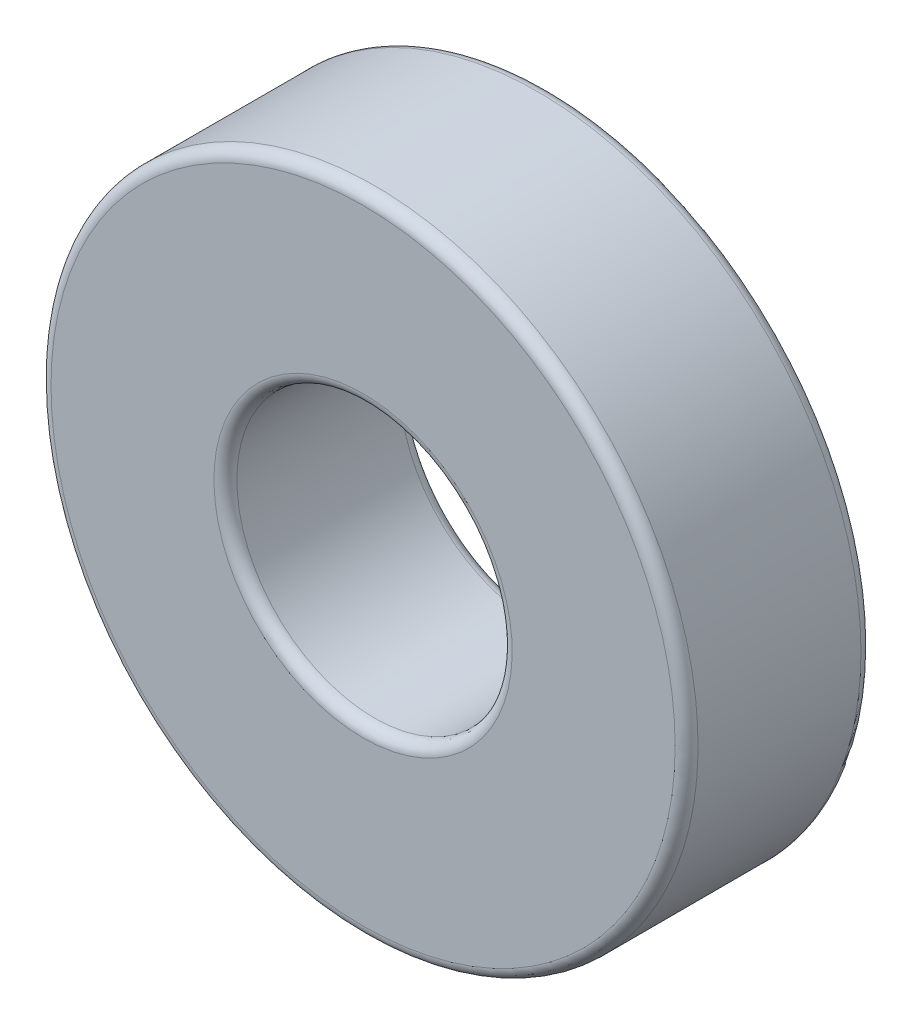
ISO-10303-21;
HEADER;
FILE_DESCRIPTION(('STEP AP214'),'2;1');
FILE_NAME('part.step','',(''),(''),'','','');
FILE_SCHEMA(('AUTOMOTIVE_DESIGN { 1 0 10303 214 1 1 1 1 }'));
ENDSEC;
DATA;
#1=APPLICATION_CONTEXT('core data for automotive mechanical design processes');
#2=APPLICATION_PROTOCOL_DEFINITION('international standard','automotive_design',2000,#1);
#3=PRODUCT_CONTEXT('',#1,'mechanical');
#4=PRODUCT('Part','Part','',(#3));
#5=PRODUCT_RELATED_PRODUCT_CATEGORY('part','',(#4));
#6=PRODUCT_DEFINITION_FORMATION('','',#4);
#7=PRODUCT_DEFINITION_CONTEXT('part definition',#1,'design');
#8=PRODUCT_DEFINITION('design','',#6,#7);
#9=PRODUCT_DEFINITION_SHAPE('','',#8);
#10=(LENGTH_UNIT() NAMED_UNIT(*) SI_UNIT(.MILLI.,.METRE.));
#11=(NAMED_UNIT(*) PLANE_ANGLE_UNIT() SI_UNIT($,.RADIAN.));
#12=(NAMED_UNIT(*) SI_UNIT($,.STERADIAN.) SOLID_ANGLE_UNIT());
#13=UNCERTAINTY_MEASURE_WITH_UNIT(LENGTH_MEASURE(1.E-05),#10,'distance_accuracy_value','');
#14=(GEOMETRIC_REPRESENTATION_CONTEXT(3) GLOBAL_UNCERTAINTY_ASSIGNED_CONTEXT((#13)) GLOBAL_UNIT_ASSIGNED_CONTEXT((#10,
#11,#12)) REPRESENTATION_CONTEXT('',''));
#15=CARTESIAN_POINT('',(0.,0.,0.));
#16=DIRECTION('',(0.,0.,1.));
#17=DIRECTION('',(1.,0.,0.));
#18=AXIS2_PLACEMENT_3D('',#15,#16,#17);
#19=CARTESIAN_POINT('',(1.95949363399733,6.33477656260915E-06,47.9808224589213));
#20=DIRECTION('',(0.,0.,-1.));
#21=DIRECTION('',(-1.,0.,0.));
#22=AXIS2_PLACEMENT_3D('',#19,#20,#21);
#23=CYLINDRICAL_SURFACE('',#22,14.1);
#24=CARTESIAN_POINT('',(1.95949363399733,6.33477656260915E-06,0.5));
#25=DIRECTION('',(0.,0.,1.));
#26=DIRECTION('',(1.,0.,0.));
#27=AXIS2_PLACEMENT_3D('',#24,#25,#26);
#28=CIRCLE('',#27,14.1);
#29=CARTESIAN_POINT('',(16.0594936339973,6.33477656260915E-06,0.5));
#30=VERTEX_POINT('',#29);
#31=EDGE_CURVE('E58',#30,#30,#28,.T.);
#32=ORIENTED_EDGE('',*,*,#31,.T.);
#33=EDGE_LOOP('',(#32));
#34=FACE_BOUND('',#33,.T.);
#35=CARTESIAN_POINT('',(1.95949363399733,6.33477656260915E-06,7.60000000000002));
#36=DIRECTION('',(0.,0.,1.));
#37=DIRECTION('',(0.,-1.,0.));
#38=AXIS2_PLACEMENT_3D('',#35,#36,#37);
#39=CIRCLE('',#38,14.1);
#40=CARTESIAN_POINT('',(1.95949363399733,-14.0999936652234,7.60000000000002));
#41=VERTEX_POINT('',#40);
#42=EDGE_CURVE('E61',#41,#41,#39,.F.);
#43=ORIENTED_EDGE('',*,*,#42,.T.);
#44=EDGE_LOOP('',(#43));
#45=FACE_BOUND('',#44,.T.);
#46=ADVANCED_FACE('F32',(#34,#45),#23,.T.);
#47=CARTESIAN_POINT('',(1.95949363399733,6.33477656260915E-06,0.));
#48=DIRECTION('',(0.,0.,1.));
#49=DIRECTION('',(1.,0.,0.));
#50=AXIS2_PLACEMENT_3D('',#47,#48,#49);
#51=PLANE('',#50);
#52=CARTESIAN_POINT('',(1.95949363399733,6.33477656260915E-06,0.));
#53=DIRECTION('',(0.,0.,1.));
#54=DIRECTION('',(1.,0.,0.));
#55=AXIS2_PLACEMENT_3D('',#52,#53,#54);
#56=CIRCLE('',#55,13.6);
#57=CARTESIAN_POINT('',(15.5594936339973,6.33477656260915E-06,0.));
#58=VERTEX_POINT('',#57);
#59=EDGE_CURVE('E52',#58,#58,#56,.F.);
#60=ORIENTED_EDGE('',*,*,#59,.T.);
#61=EDGE_LOOP('',(#60));
#62=FACE_BOUND('',#61,.T.);
#63=CARTESIAN_POINT('',(1.95949363399733,6.33477656260915E-06,0.));
#64=DIRECTION('',(0.,0.,1.));
#65=DIRECTION('',(1.,0.,0.));
#66=AXIS2_PLACEMENT_3D('',#63,#64,#65);
#67=CIRCLE('',#66,6.5);
#68=CARTESIAN_POINT('',(8.45949363399733,6.33477656260915E-06,0.));
#69=VERTEX_POINT('',#68);
#70=EDGE_CURVE('E55',#69,#69,#67,.T.);
#71=ORIENTED_EDGE('',*,*,#70,.T.);
#72=EDGE_LOOP('',(#71));
#73=FACE_BOUND('',#72,.T.);
#74=ADVANCED_FACE('F79',(#62,#73),#51,.F.);
#75=CARTESIAN_POINT('',(1.95949363399733,6.33477656260915E-06,47.9808224589213));
#76=DIRECTION('',(0.,0.,-1.));
#77=DIRECTION('',(-1.,0.,0.));
#78=AXIS2_PLACEMENT_3D('',#75,#76,#77);
#79=CYLINDRICAL_SURFACE('',#78,6.);
#80=CARTESIAN_POINT('',(1.95949363399733,6.33477656260915E-06,0.5));
#81=DIRECTION('',(0.,0.,1.));
#82=DIRECTION('',(1.,0.,0.));
#83=AXIS2_PLACEMENT_3D('',#80,#81,#82);
#84=CIRCLE('',#83,6.);
#85=CARTESIAN_POINT('',(7.95949363399733,6.33477656260915E-06,0.5));
#86=VERTEX_POINT('',#85);
#87=EDGE_CURVE('E43',#86,#86,#84,.F.);
#88=ORIENTED_EDGE('',*,*,#87,.T.);
#89=EDGE_LOOP('',(#88));
#90=FACE_BOUND('',#89,.T.);
#91=CARTESIAN_POINT('',(1.95949363399733,6.33477656260915E-06,7.60000000000002));
#92=DIRECTION('',(0.,0.,1.));
#93=DIRECTION('',(0.,-1.,0.));
#94=AXIS2_PLACEMENT_3D('',#91,#92,#93);
#95=CIRCLE('',#94,6.);
#96=CARTESIAN_POINT('',(1.95949363399733,-5.99999366522343,7.60000000000002));
#97=VERTEX_POINT('',#96);
#98=EDGE_CURVE('E47',#97,#97,#95,.T.);
#99=ORIENTED_EDGE('',*,*,#98,.T.);
#100=EDGE_LOOP('',(#99));
#101=FACE_BOUND('',#100,.T.);
#102=ADVANCED_FACE('F85',(#90,#101),#79,.F.);
#103=CARTESIAN_POINT('',(1.95949363399731,6.33477664725365E-06,8.10000000000001));
#104=DIRECTION('',(0.,0.,1.));
#105=DIRECTION('',(-0.17146403843439,-0.985190379329686,0.));
#106=AXIS2_PLACEMENT_3D('',#103,#104,#105);
#107=PLANE('',#106);
#108=CARTESIAN_POINT('',(1.95949363399733,6.33477656267849E-06,8.10000000000001));
#109=DIRECTION('',(0.,0.,1.));
#110=DIRECTION('',(0.,-1.,0.));
#111=AXIS2_PLACEMENT_3D('',#108,#109,#110);
#112=CIRCLE('',#111,13.6);
#113=CARTESIAN_POINT('',(1.95949363399733,-13.5999936652234,8.10000000000002));
#114=VERTEX_POINT('',#113);
#115=EDGE_CURVE('E10',#114,#114,#112,.T.);
#116=ORIENTED_EDGE('',*,*,#115,.T.);
#117=EDGE_LOOP('',(#116));
#118=FACE_BOUND('',#117,.T.);
#119=CARTESIAN_POINT('',(1.95949363399733,6.33477656267849E-06,8.10000000000001));
#120=DIRECTION('',(0.,0.,1.));
#121=DIRECTION('',(0.,-1.,0.));
#122=AXIS2_PLACEMENT_3D('',#119,#120,#121);
#123=CIRCLE('',#122,6.5);
#124=CARTESIAN_POINT('',(1.95949363399733,-6.49999366522343,8.10000000000002));
#125=VERTEX_POINT('',#124);
#126=EDGE_CURVE('E39',#125,#125,#123,.F.);
#127=ORIENTED_EDGE('',*,*,#126,.T.);
#128=EDGE_LOOP('',(#127));
#129=FACE_BOUND('',#128,.T.);
#130=ADVANCED_FACE('F91',(#118,#129),#107,.T.);
#131=CARTESIAN_POINT('',(1.95949363399733,6.33477656260915E-06,0.5));
#132=DIRECTION('',(0.,0.,1.));
#133=DIRECTION('',(1.,0.,0.));
#134=AXIS2_PLACEMENT_3D('',#131,#132,#133);
#135=TOROIDAL_SURFACE('',#134,13.6,0.5);
#136=ORIENTED_EDGE('',*,*,#59,.F.);
#137=EDGE_LOOP('',(#136));
#138=FACE_BOUND('',#137,.T.);
#139=ORIENTED_EDGE('',*,*,#31,.F.);
#140=EDGE_LOOP('',(#139));
#141=FACE_BOUND('',#140,.T.);
#142=ADVANCED_FACE('F75',(#138,#141),#135,.T.);
#143=CARTESIAN_POINT('',(1.95949363399733,6.33477656260915E-06,0.5));
#144=DIRECTION('',(0.,0.,1.));
#145=DIRECTION('',(1.,0.,0.));
#146=AXIS2_PLACEMENT_3D('',#143,#144,#145);
#147=TOROIDAL_SURFACE('',#146,6.5,0.5);
#148=ORIENTED_EDGE('',*,*,#87,.F.);
#149=EDGE_LOOP('',(#148));
#150=FACE_BOUND('',#149,.T.);
#151=ORIENTED_EDGE('',*,*,#70,.F.);
#152=EDGE_LOOP('',(#151));
#153=FACE_BOUND('',#152,.T.);
#154=ADVANCED_FACE('F69',(#150,#153),#147,.T.);
#155=CARTESIAN_POINT('',(1.95949363399733,6.33477656260915E-06,7.60000000000002));
#156=DIRECTION('',(0.,0.,1.));
#157=DIRECTION('',(0.,-1.,0.));
#158=AXIS2_PLACEMENT_3D('',#155,#156,#157);
#159=TOROIDAL_SURFACE('',#158,13.6,0.5);
#160=ORIENTED_EDGE('',*,*,#42,.F.);
#161=EDGE_LOOP('',(#160));
#162=FACE_BOUND('',#161,.T.);
#163=ORIENTED_EDGE('',*,*,#115,.F.);
#164=EDGE_LOOP('',(#163));
#165=FACE_BOUND('',#164,.T.);
#166=ADVANCED_FACE('F66',(#162,#165),#159,.T.);
#167=CARTESIAN_POINT('',(1.95949363399733,6.33477656260915E-06,7.60000000000002));
#168=DIRECTION('',(0.,0.,1.));
#169=DIRECTION('',(0.,-1.,0.));
#170=AXIS2_PLACEMENT_3D('',#167,#168,#169);
#171=TOROIDAL_SURFACE('',#170,6.5,0.5);
#172=ORIENTED_EDGE('',*,*,#126,.F.);
#173=EDGE_LOOP('',(#172));
#174=FACE_BOUND('',#173,.T.);
#175=ORIENTED_EDGE('',*,*,#98,.F.);
#176=EDGE_LOOP('',(#175));
#177=FACE_BOUND('',#176,.T.);
#178=ADVANCED_FACE('F34',(#174,#177),#171,.T.);
#179=CLOSED_SHELL('',(#46,#74,#102,#130,#142,#154,#166,#178));
#180=MANIFOLD_SOLID_BREP('B2',#179);
#181=ADVANCED_BREP_SHAPE_REPRESENTATION('',(#18,#180),#14);
#182=SHAPE_DEFINITION_REPRESENTATION(#9,#181);
ENDSEC;
END-ISO-10303-21;
